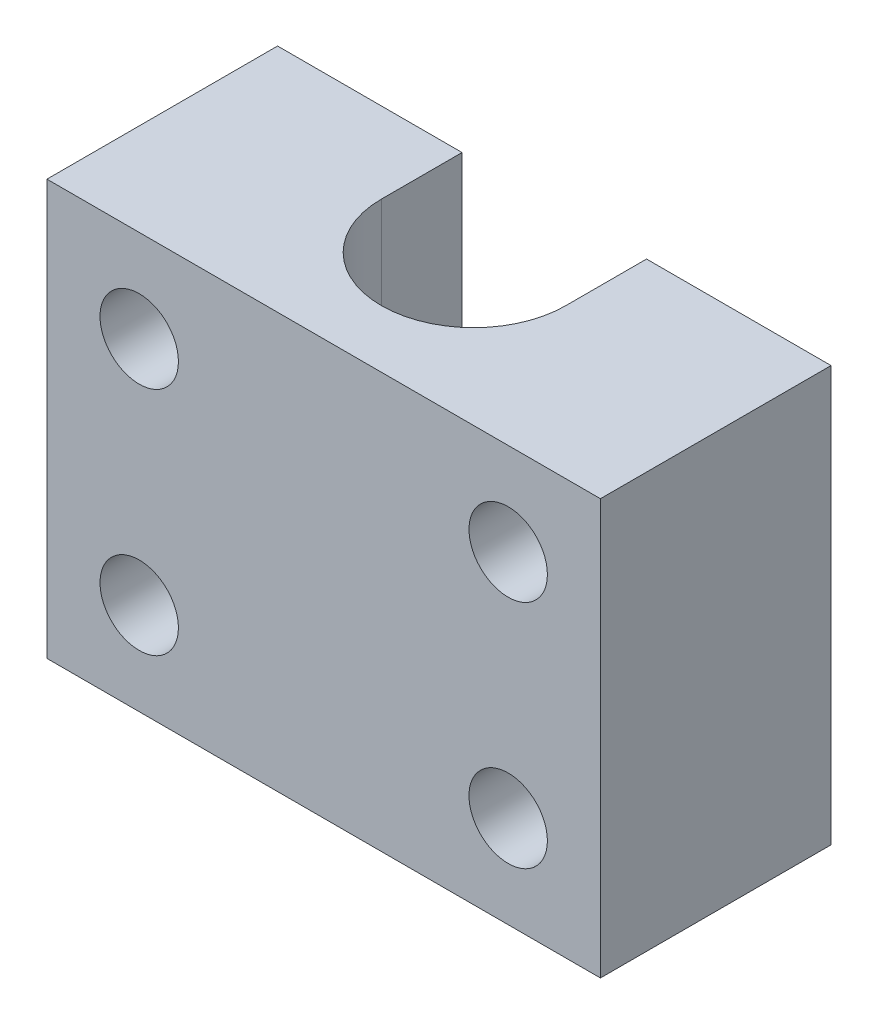
ISO-10303-21;
HEADER;
FILE_DESCRIPTION(('STEP AP214'),'2;1');
FILE_NAME('part.step','',(''),(''),'','','');
FILE_SCHEMA(('AUTOMOTIVE_DESIGN { 1 0 10303 214 1 1 1 1 }'));
ENDSEC;
DATA;
#1=APPLICATION_CONTEXT('core data for automotive mechanical design processes');
#2=APPLICATION_PROTOCOL_DEFINITION('international standard','automotive_design',2000,#1);
#3=PRODUCT_CONTEXT('',#1,'mechanical');
#4=PRODUCT('Part','Part','',(#3));
#5=PRODUCT_RELATED_PRODUCT_CATEGORY('part','',(#4));
#6=PRODUCT_DEFINITION_FORMATION('','',#4);
#7=PRODUCT_DEFINITION_CONTEXT('part definition',#1,'design');
#8=PRODUCT_DEFINITION('design','',#6,#7);
#9=PRODUCT_DEFINITION_SHAPE('','',#8);
#10=(LENGTH_UNIT() NAMED_UNIT(*) SI_UNIT(.MILLI.,.METRE.));
#11=(NAMED_UNIT(*) PLANE_ANGLE_UNIT() SI_UNIT($,.RADIAN.));
#12=(NAMED_UNIT(*) SI_UNIT($,.STERADIAN.) SOLID_ANGLE_UNIT());
#13=UNCERTAINTY_MEASURE_WITH_UNIT(LENGTH_MEASURE(1.E-05),#10,'distance_accuracy_value','');
#14=(GEOMETRIC_REPRESENTATION_CONTEXT(3) GLOBAL_UNCERTAINTY_ASSIGNED_CONTEXT((#13)) GLOBAL_UNIT_ASSIGNED_CONTEXT((#10,
#11,#12)) REPRESENTATION_CONTEXT('',''));
#15=CARTESIAN_POINT('',(0.,0.,0.));
#16=DIRECTION('',(0.,0.,1.));
#17=DIRECTION('',(1.,0.,0.));
#18=AXIS2_PLACEMENT_3D('',#15,#16,#17);
#19=CARTESIAN_POINT('',(12.,9.,-3.5));
#20=DIRECTION('',(0.,0.,1.));
#21=DIRECTION('',(1.,0.,0.));
#22=AXIS2_PLACEMENT_3D('',#19,#20,#21);
#23=PLANE('',#22);
#24=CARTESIAN_POINT('',(8.00000000000002,5.,-3.5));
#25=DIRECTION('',(0.,0.,1.));
#26=DIRECTION('',(1.,0.,0.));
#27=AXIS2_PLACEMENT_3D('',#24,#25,#26);
#28=CIRCLE('',#27,1.70000000000001);
#29=CARTESIAN_POINT('',(9.70000000000003,5.,-3.5));
#30=VERTEX_POINT('',#29);
#31=EDGE_CURVE('E230',#30,#30,#28,.T.);
#32=ORIENTED_EDGE('',*,*,#31,.T.);
#33=EDGE_LOOP('',(#32));
#34=FACE_BOUND('',#33,.T.);
#35=CARTESIAN_POINT('',(8.00000000000002,-5.,-3.5));
#36=DIRECTION('',(0.,0.,1.));
#37=DIRECTION('',(1.,0.,0.));
#38=AXIS2_PLACEMENT_3D('',#35,#36,#37);
#39=CIRCLE('',#38,1.70000000000001);
#40=CARTESIAN_POINT('',(9.70000000000003,-5.,-3.5));
#41=VERTEX_POINT('',#40);
#42=EDGE_CURVE('E169',#41,#41,#39,.T.);
#43=ORIENTED_EDGE('',*,*,#42,.T.);
#44=EDGE_LOOP('',(#43));
#45=FACE_BOUND('',#44,.T.);
#46=DIRECTION('',(1.,0.,0.));
#47=VECTOR('',#46,1.);
#48=CARTESIAN_POINT('',(-12.,-9.,-3.5));
#49=LINE('',#48,#47);
#50=CARTESIAN_POINT('',(4.00000000000001,-9.,-3.5));
#51=VERTEX_POINT('',#50);
#52=CARTESIAN_POINT('',(12.,-9.,-3.5));
#53=VERTEX_POINT('',#52);
#54=EDGE_CURVE('E55',#51,#53,#49,.T.);
#55=ORIENTED_EDGE('',*,*,#54,.F.);
#56=DIRECTION('',(0.,1.,0.));
#57=VECTOR('',#56,1.);
#58=CARTESIAN_POINT('',(4.00000000000001,-9.,-3.5));
#59=LINE('',#58,#57);
#60=CARTESIAN_POINT('',(4.00000000000001,9.,-3.5));
#61=VERTEX_POINT('',#60);
#62=EDGE_CURVE('E103',#51,#61,#59,.T.);
#63=ORIENTED_EDGE('',*,*,#62,.T.);
#64=DIRECTION('',(-1.,0.,0.));
#65=VECTOR('',#64,1.);
#66=CARTESIAN_POINT('',(12.,9.,-3.5));
#67=LINE('',#66,#65);
#68=CARTESIAN_POINT('',(12.,9.,-3.5));
#69=VERTEX_POINT('',#68);
#70=EDGE_CURVE('E125',#69,#61,#67,.T.);
#71=ORIENTED_EDGE('',*,*,#70,.F.);
#72=DIRECTION('',(0.,1.,0.));
#73=VECTOR('',#72,1.);
#74=CARTESIAN_POINT('',(12.,-9.,-3.5));
#75=LINE('',#74,#73);
#76=EDGE_CURVE('E119',#53,#69,#75,.T.);
#77=ORIENTED_EDGE('',*,*,#76,.F.);
#78=EDGE_LOOP('',(#55,#63,#71,#77));
#79=FACE_BOUND('',#78,.T.);
#80=ADVANCED_FACE('F30',(#34,#45,#79),#23,.F.);
#81=CARTESIAN_POINT('',(12.,-9.,-3.5));
#82=DIRECTION('',(1.,0.,0.));
#83=DIRECTION('',(0.,0.,-1.));
#84=AXIS2_PLACEMENT_3D('',#81,#82,#83);
#85=PLANE('',#84);
#86=DIRECTION('',(0.,1.,0.));
#87=VECTOR('',#86,1.);
#88=CARTESIAN_POINT('',(12.,-9.,6.5));
#89=LINE('',#88,#87);
#90=CARTESIAN_POINT('',(12.,-9.,6.5));
#91=VERTEX_POINT('',#90);
#92=CARTESIAN_POINT('',(12.,9.,6.5));
#93=VERTEX_POINT('',#92);
#94=EDGE_CURVE('E129',#91,#93,#89,.T.);
#95=ORIENTED_EDGE('',*,*,#94,.F.);
#96=DIRECTION('',(0.,0.,1.));
#97=VECTOR('',#96,1.);
#98=CARTESIAN_POINT('',(12.,-9.,-3.5));
#99=LINE('',#98,#97);
#100=EDGE_CURVE('E11',#53,#91,#99,.T.);
#101=ORIENTED_EDGE('',*,*,#100,.F.);
#102=ORIENTED_EDGE('',*,*,#76,.T.);
#103=DIRECTION('',(0.,0.,1.));
#104=VECTOR('',#103,1.);
#105=CARTESIAN_POINT('',(12.,9.,-3.5));
#106=LINE('',#105,#104);
#107=EDGE_CURVE('E34',#69,#93,#106,.T.);
#108=ORIENTED_EDGE('',*,*,#107,.T.);
#109=EDGE_LOOP('',(#95,#101,#102,#108));
#110=FACE_BOUND('',#109,.T.);
#111=ADVANCED_FACE('F32',(#110),#85,.T.);
#112=CARTESIAN_POINT('',(-12.,-9.,-3.5));
#113=DIRECTION('',(0.,-1.,0.));
#114=DIRECTION('',(0.,0.,-1.));
#115=AXIS2_PLACEMENT_3D('',#112,#113,#114);
#116=PLANE('',#115);
#117=DIRECTION('',(0.,0.,-1.));
#118=VECTOR('',#117,1.);
#119=CARTESIAN_POINT('',(4.00000000000001,-9.,0.));
#120=LINE('',#119,#118);
#121=CARTESIAN_POINT('',(4.00000000000002,-9.,0.));
#122=VERTEX_POINT('',#121);
#123=EDGE_CURVE('E105',#122,#51,#120,.T.);
#124=ORIENTED_EDGE('',*,*,#123,.T.);
#125=ORIENTED_EDGE('',*,*,#54,.T.);
#126=ORIENTED_EDGE('',*,*,#100,.T.);
#127=DIRECTION('',(1.,0.,0.));
#128=VECTOR('',#127,1.);
#129=CARTESIAN_POINT('',(-12.,-9.,6.5));
#130=LINE('',#129,#128);
#131=CARTESIAN_POINT('',(-12.,-9.,6.5));
#132=VERTEX_POINT('',#131);
#133=EDGE_CURVE('E139',#132,#91,#130,.T.);
#134=ORIENTED_EDGE('',*,*,#133,.F.);
#135=DIRECTION('',(0.,0.,1.));
#136=VECTOR('',#135,1.);
#137=CARTESIAN_POINT('',(-12.,-9.,-3.5));
#138=LINE('',#137,#136);
#139=CARTESIAN_POINT('',(-12.,-9.,-3.5));
#140=VERTEX_POINT('',#139);
#141=EDGE_CURVE('E39',#140,#132,#138,.T.);
#142=ORIENTED_EDGE('',*,*,#141,.F.);
#143=CARTESIAN_POINT('',(-4.,-9.,-3.5));
#144=VERTEX_POINT('',#143);
#145=EDGE_CURVE('E120',#140,#144,#49,.T.);
#146=ORIENTED_EDGE('',*,*,#145,.T.);
#147=DIRECTION('',(0.,0.,1.));
#148=VECTOR('',#147,1.);
#149=CARTESIAN_POINT('',(-4.,-9.,-3.5));
#150=LINE('',#149,#148);
#151=CARTESIAN_POINT('',(-4.,-9.,0.));
#152=VERTEX_POINT('',#151);
#153=EDGE_CURVE('E47',#144,#152,#150,.T.);
#154=ORIENTED_EDGE('',*,*,#153,.T.);
#155=CARTESIAN_POINT('',(0.,-9.,0.));
#156=DIRECTION('',(0.,1.,0.));
#157=DIRECTION('',(0.,0.,1.));
#158=AXIS2_PLACEMENT_3D('',#155,#156,#157);
#159=CIRCLE('',#158,4.00000000000001);
#160=EDGE_CURVE('E111',#152,#122,#159,.T.);
#161=ORIENTED_EDGE('',*,*,#160,.T.);
#162=EDGE_LOOP('',(#124,#125,#126,#134,#142,#146,#154,#161));
#163=FACE_BOUND('',#162,.T.);
#164=ADVANCED_FACE('F113',(#163),#116,.T.);
#165=CARTESIAN_POINT('',(-12.,9.,-3.5));
#166=DIRECTION('',(-1.,0.,0.));
#167=DIRECTION('',(0.,0.,1.));
#168=AXIS2_PLACEMENT_3D('',#165,#166,#167);
#169=PLANE('',#168);
#170=DIRECTION('',(0.,-1.,0.));
#171=VECTOR('',#170,1.);
#172=CARTESIAN_POINT('',(-12.,9.,6.5));
#173=LINE('',#172,#171);
#174=CARTESIAN_POINT('',(-12.,9.,6.5));
#175=VERTEX_POINT('',#174);
#176=EDGE_CURVE('E136',#175,#132,#173,.T.);
#177=ORIENTED_EDGE('',*,*,#176,.F.);
#178=DIRECTION('',(0.,0.,1.));
#179=VECTOR('',#178,1.);
#180=CARTESIAN_POINT('',(-12.,9.,-3.5));
#181=LINE('',#180,#179);
#182=CARTESIAN_POINT('',(-12.,9.,-3.5));
#183=VERTEX_POINT('',#182);
#184=EDGE_CURVE('E142',#183,#175,#181,.T.);
#185=ORIENTED_EDGE('',*,*,#184,.F.);
#186=DIRECTION('',(0.,-1.,0.));
#187=VECTOR('',#186,1.);
#188=CARTESIAN_POINT('',(-12.,9.,-3.5));
#189=LINE('',#188,#187);
#190=EDGE_CURVE('E121',#183,#140,#189,.T.);
#191=ORIENTED_EDGE('',*,*,#190,.T.);
#192=ORIENTED_EDGE('',*,*,#141,.T.);
#193=EDGE_LOOP('',(#177,#185,#191,#192));
#194=FACE_BOUND('',#193,.T.);
#195=ADVANCED_FACE('F152',(#194),#169,.T.);
#196=CARTESIAN_POINT('',(12.,9.,-3.5));
#197=DIRECTION('',(0.,1.,0.));
#198=DIRECTION('',(0.,0.,1.));
#199=AXIS2_PLACEMENT_3D('',#196,#197,#198);
#200=PLANE('',#199);
#201=DIRECTION('',(0.,0.,-1.));
#202=VECTOR('',#201,1.);
#203=CARTESIAN_POINT('',(4.00000000000001,9.,0.));
#204=LINE('',#203,#202);
#205=CARTESIAN_POINT('',(4.00000000000002,9.,0.));
#206=VERTEX_POINT('',#205);
#207=EDGE_CURVE('E108',#206,#61,#204,.T.);
#208=ORIENTED_EDGE('',*,*,#207,.F.);
#209=CARTESIAN_POINT('',(0.,9.,0.));
#210=DIRECTION('',(0.,1.,0.));
#211=DIRECTION('',(0.,0.,1.));
#212=AXIS2_PLACEMENT_3D('',#209,#210,#211);
#213=CIRCLE('',#212,4.00000000000001);
#214=CARTESIAN_POINT('',(-4.,9.,0.));
#215=VERTEX_POINT('',#214);
#216=EDGE_CURVE('E115',#215,#206,#213,.T.);
#217=ORIENTED_EDGE('',*,*,#216,.F.);
#218=DIRECTION('',(0.,0.,1.));
#219=VECTOR('',#218,1.);
#220=CARTESIAN_POINT('',(-4.,9.,-3.5));
#221=LINE('',#220,#219);
#222=CARTESIAN_POINT('',(-4.,9.,-3.5));
#223=VERTEX_POINT('',#222);
#224=EDGE_CURVE('E165',#223,#215,#221,.T.);
#225=ORIENTED_EDGE('',*,*,#224,.F.);
#226=EDGE_CURVE('E156',#223,#183,#67,.T.);
#227=ORIENTED_EDGE('',*,*,#226,.T.);
#228=ORIENTED_EDGE('',*,*,#184,.T.);
#229=DIRECTION('',(-1.,0.,0.));
#230=VECTOR('',#229,1.);
#231=CARTESIAN_POINT('',(12.,9.,6.5));
#232=LINE('',#231,#230);
#233=EDGE_CURVE('E132',#93,#175,#232,.T.);
#234=ORIENTED_EDGE('',*,*,#233,.F.);
#235=ORIENTED_EDGE('',*,*,#107,.F.);
#236=ORIENTED_EDGE('',*,*,#70,.T.);
#237=EDGE_LOOP('',(#208,#217,#225,#227,#228,#234,#235,#236));
#238=FACE_BOUND('',#237,.T.);
#239=ADVANCED_FACE('F146',(#238),#200,.T.);
#240=CARTESIAN_POINT('',(-8.,-5.,-3.5));
#241=DIRECTION('',(0.,0.,1.));
#242=DIRECTION('',(1.,0.,0.));
#243=AXIS2_PLACEMENT_3D('',#240,#241,#242);
#244=CIRCLE('',#243,1.70000000000001);
#245=CARTESIAN_POINT('',(-6.29999999999998,-5.,-3.5));
#246=VERTEX_POINT('',#245);
#247=EDGE_CURVE('E206',#246,#246,#244,.T.);
#248=ORIENTED_EDGE('',*,*,#247,.T.);
#249=EDGE_LOOP('',(#248));
#250=FACE_BOUND('',#249,.T.);
#251=CARTESIAN_POINT('',(-8.,5.,-3.5));
#252=DIRECTION('',(0.,0.,1.));
#253=DIRECTION('',(1.,0.,0.));
#254=AXIS2_PLACEMENT_3D('',#251,#252,#253);
#255=CIRCLE('',#254,1.70000000000001);
#256=CARTESIAN_POINT('',(-6.29999999999998,5.,-3.5));
#257=VERTEX_POINT('',#256);
#258=EDGE_CURVE('E209',#257,#257,#255,.T.);
#259=ORIENTED_EDGE('',*,*,#258,.T.);
#260=EDGE_LOOP('',(#259));
#261=FACE_BOUND('',#260,.T.);
#262=ORIENTED_EDGE('',*,*,#226,.F.);
#263=DIRECTION('',(0.,1.,0.));
#264=VECTOR('',#263,1.);
#265=CARTESIAN_POINT('',(-4.,-9.,-3.5));
#266=LINE('',#265,#264);
#267=EDGE_CURVE('E110',#144,#223,#266,.T.);
#268=ORIENTED_EDGE('',*,*,#267,.F.);
#269=ORIENTED_EDGE('',*,*,#145,.F.);
#270=ORIENTED_EDGE('',*,*,#190,.F.);
#271=EDGE_LOOP('',(#262,#268,#269,#270));
#272=FACE_BOUND('',#271,.T.);
#273=ADVANCED_FACE('F155',(#250,#261,#272),#23,.F.);
#274=CARTESIAN_POINT('',(12.,9.,6.5));
#275=DIRECTION('',(0.,0.,1.));
#276=DIRECTION('',(1.,0.,0.));
#277=AXIS2_PLACEMENT_3D('',#274,#275,#276);
#278=PLANE('',#277);
#279=CARTESIAN_POINT('',(8.00000000000002,5.,6.5));
#280=DIRECTION('',(0.,0.,1.));
#281=DIRECTION('',(1.,0.,0.));
#282=AXIS2_PLACEMENT_3D('',#279,#280,#281);
#283=CIRCLE('',#282,1.70000000000001);
#284=CARTESIAN_POINT('',(9.70000000000003,5.,6.5));
#285=VERTEX_POINT('',#284);
#286=EDGE_CURVE('E232',#285,#285,#283,.T.);
#287=ORIENTED_EDGE('',*,*,#286,.F.);
#288=EDGE_LOOP('',(#287));
#289=FACE_BOUND('',#288,.T.);
#290=CARTESIAN_POINT('',(-8.,-5.,6.5));
#291=DIRECTION('',(0.,0.,1.));
#292=DIRECTION('',(1.,0.,0.));
#293=AXIS2_PLACEMENT_3D('',#290,#291,#292);
#294=CIRCLE('',#293,1.70000000000001);
#295=CARTESIAN_POINT('',(-6.29999999999998,-5.,6.5));
#296=VERTEX_POINT('',#295);
#297=EDGE_CURVE('E227',#296,#296,#294,.T.);
#298=ORIENTED_EDGE('',*,*,#297,.F.);
#299=EDGE_LOOP('',(#298));
#300=FACE_BOUND('',#299,.T.);
#301=CARTESIAN_POINT('',(-8.,5.,6.5));
#302=DIRECTION('',(0.,0.,1.));
#303=DIRECTION('',(1.,0.,0.));
#304=AXIS2_PLACEMENT_3D('',#301,#302,#303);
#305=CIRCLE('',#304,1.70000000000001);
#306=CARTESIAN_POINT('',(-6.29999999999998,5.,6.5));
#307=VERTEX_POINT('',#306);
#308=EDGE_CURVE('E212',#307,#307,#305,.T.);
#309=ORIENTED_EDGE('',*,*,#308,.F.);
#310=EDGE_LOOP('',(#309));
#311=FACE_BOUND('',#310,.T.);
#312=CARTESIAN_POINT('',(8.00000000000002,-5.,6.5));
#313=DIRECTION('',(0.,0.,1.));
#314=DIRECTION('',(1.,0.,0.));
#315=AXIS2_PLACEMENT_3D('',#312,#313,#314);
#316=CIRCLE('',#315,1.70000000000001);
#317=CARTESIAN_POINT('',(9.70000000000003,-5.,6.5));
#318=VERTEX_POINT('',#317);
#319=EDGE_CURVE('E211',#318,#318,#316,.T.);
#320=ORIENTED_EDGE('',*,*,#319,.F.);
#321=EDGE_LOOP('',(#320));
#322=FACE_BOUND('',#321,.T.);
#323=ORIENTED_EDGE('',*,*,#94,.T.);
#324=ORIENTED_EDGE('',*,*,#233,.T.);
#325=ORIENTED_EDGE('',*,*,#176,.T.);
#326=ORIENTED_EDGE('',*,*,#133,.T.);
#327=EDGE_LOOP('',(#323,#324,#325,#326));
#328=FACE_BOUND('',#327,.T.);
#329=ADVANCED_FACE('F148',(#289,#300,#311,#322,#328),#278,.T.);
#330=CARTESIAN_POINT('',(4.00000000000001,-9.,0.));
#331=DIRECTION('',(1.,0.,0.));
#332=DIRECTION('',(0.,0.,-1.));
#333=AXIS2_PLACEMENT_3D('',#330,#331,#332);
#334=PLANE('',#333);
#335=ORIENTED_EDGE('',*,*,#207,.T.);
#336=ORIENTED_EDGE('',*,*,#62,.F.);
#337=ORIENTED_EDGE('',*,*,#123,.F.);
#338=DIRECTION('',(0.,1.,0.));
#339=VECTOR('',#338,1.);
#340=CARTESIAN_POINT('',(4.00000000000002,-9.,0.));
#341=LINE('',#340,#339);
#342=EDGE_CURVE('E133',#122,#206,#341,.T.);
#343=ORIENTED_EDGE('',*,*,#342,.T.);
#344=EDGE_LOOP('',(#335,#336,#337,#343));
#345=FACE_BOUND('',#344,.T.);
#346=ADVANCED_FACE('F104',(#345),#334,.F.);
#347=CARTESIAN_POINT('',(0.,-9.,0.));
#348=DIRECTION('',(0.,1.,0.));
#349=DIRECTION('',(0.,0.,1.));
#350=AXIS2_PLACEMENT_3D('',#347,#348,#349);
#351=CYLINDRICAL_SURFACE('',#350,4.00000000000001);
#352=ORIENTED_EDGE('',*,*,#216,.T.);
#353=ORIENTED_EDGE('',*,*,#342,.F.);
#354=ORIENTED_EDGE('',*,*,#160,.F.);
#355=DIRECTION('',(0.,1.,0.));
#356=VECTOR('',#355,1.);
#357=CARTESIAN_POINT('',(-4.,-9.,0.));
#358=LINE('',#357,#356);
#359=EDGE_CURVE('E159',#152,#215,#358,.T.);
#360=ORIENTED_EDGE('',*,*,#359,.T.);
#361=EDGE_LOOP('',(#352,#353,#354,#360));
#362=FACE_BOUND('',#361,.T.);
#363=ADVANCED_FACE('F173',(#362),#351,.F.);
#364=CARTESIAN_POINT('',(-4.,-9.,-3.5));
#365=DIRECTION('',(-1.,0.,0.));
#366=DIRECTION('',(0.,0.,1.));
#367=AXIS2_PLACEMENT_3D('',#364,#365,#366);
#368=PLANE('',#367);
#369=ORIENTED_EDGE('',*,*,#224,.T.);
#370=ORIENTED_EDGE('',*,*,#359,.F.);
#371=ORIENTED_EDGE('',*,*,#153,.F.);
#372=ORIENTED_EDGE('',*,*,#267,.T.);
#373=EDGE_LOOP('',(#369,#370,#371,#372));
#374=FACE_BOUND('',#373,.T.);
#375=ADVANCED_FACE('F174',(#374),#368,.F.);
#376=CARTESIAN_POINT('',(8.00000000000002,-5.,6.5));
#377=DIRECTION('',(0.,0.,1.));
#378=DIRECTION('',(1.,0.,0.));
#379=AXIS2_PLACEMENT_3D('',#376,#377,#378);
#380=CYLINDRICAL_SURFACE('',#379,1.70000000000001);
#381=ORIENTED_EDGE('',*,*,#42,.F.);
#382=EDGE_LOOP('',(#381));
#383=FACE_BOUND('',#382,.T.);
#384=ORIENTED_EDGE('',*,*,#319,.T.);
#385=EDGE_LOOP('',(#384));
#386=FACE_BOUND('',#385,.T.);
#387=ADVANCED_FACE('F176',(#383,#386),#380,.F.);
#388=CARTESIAN_POINT('',(-8.,5.,6.5));
#389=DIRECTION('',(0.,0.,1.));
#390=DIRECTION('',(1.,0.,0.));
#391=AXIS2_PLACEMENT_3D('',#388,#389,#390);
#392=CYLINDRICAL_SURFACE('',#391,1.70000000000001);
#393=ORIENTED_EDGE('',*,*,#258,.F.);
#394=EDGE_LOOP('',(#393));
#395=FACE_BOUND('',#394,.T.);
#396=ORIENTED_EDGE('',*,*,#308,.T.);
#397=EDGE_LOOP('',(#396));
#398=FACE_BOUND('',#397,.T.);
#399=ADVANCED_FACE('F182',(#395,#398),#392,.F.);
#400=CARTESIAN_POINT('',(-8.,-5.,6.5));
#401=DIRECTION('',(0.,0.,1.));
#402=DIRECTION('',(1.,0.,0.));
#403=AXIS2_PLACEMENT_3D('',#400,#401,#402);
#404=CYLINDRICAL_SURFACE('',#403,1.70000000000001);
#405=ORIENTED_EDGE('',*,*,#247,.F.);
#406=EDGE_LOOP('',(#405));
#407=FACE_BOUND('',#406,.T.);
#408=ORIENTED_EDGE('',*,*,#297,.T.);
#409=EDGE_LOOP('',(#408));
#410=FACE_BOUND('',#409,.T.);
#411=ADVANCED_FACE('F243',(#407,#410),#404,.F.);
#412=CARTESIAN_POINT('',(8.00000000000002,5.,6.5));
#413=DIRECTION('',(0.,0.,1.));
#414=DIRECTION('',(1.,0.,0.));
#415=AXIS2_PLACEMENT_3D('',#412,#413,#414);
#416=CYLINDRICAL_SURFACE('',#415,1.70000000000001);
#417=ORIENTED_EDGE('',*,*,#31,.F.);
#418=EDGE_LOOP('',(#417));
#419=FACE_BOUND('',#418,.T.);
#420=ORIENTED_EDGE('',*,*,#286,.T.);
#421=EDGE_LOOP('',(#420));
#422=FACE_BOUND('',#421,.T.);
#423=ADVANCED_FACE('F236',(#419,#422),#416,.F.);
#424=CLOSED_SHELL('',(#80,#111,#164,#195,#239,#273,#329,#346,#363,#375,#387,#399,#411,#423));
#425=MANIFOLD_SOLID_BREP('B2',#424);
#426=ADVANCED_BREP_SHAPE_REPRESENTATION('',(#18,#425),#14);
#427=SHAPE_DEFINITION_REPRESENTATION(#9,#426);
ENDSEC;
END-ISO-10303-21;
